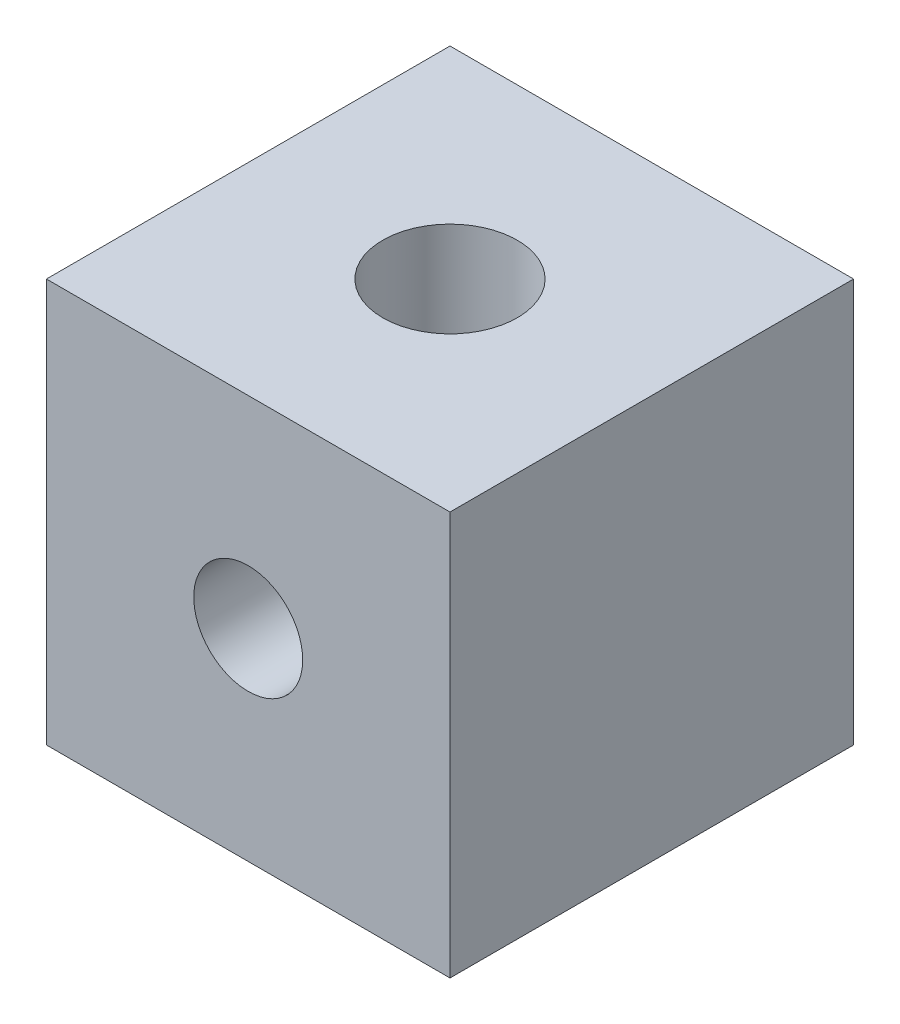
ISO-10303-21;
HEADER;
FILE_DESCRIPTION(('STEP AP214'),'2;1');
FILE_NAME('part.step','',(''),(''),'','','');
FILE_SCHEMA(('AUTOMOTIVE_DESIGN { 1 0 10303 214 1 1 1 1 }'));
ENDSEC;
DATA;
#1=APPLICATION_CONTEXT('core data for automotive mechanical design processes');
#2=APPLICATION_PROTOCOL_DEFINITION('international standard','automotive_design',2000,#1);
#3=PRODUCT_CONTEXT('',#1,'mechanical');
#4=PRODUCT('Part','Part','',(#3));
#5=PRODUCT_RELATED_PRODUCT_CATEGORY('part','',(#4));
#6=PRODUCT_DEFINITION_FORMATION('','',#4);
#7=PRODUCT_DEFINITION_CONTEXT('part definition',#1,'design');
#8=PRODUCT_DEFINITION('design','',#6,#7);
#9=PRODUCT_DEFINITION_SHAPE('','',#8);
#10=(LENGTH_UNIT() NAMED_UNIT(*) SI_UNIT(.MILLI.,.METRE.));
#11=(NAMED_UNIT(*) PLANE_ANGLE_UNIT() SI_UNIT($,.RADIAN.));
#12=(NAMED_UNIT(*) SI_UNIT($,.STERADIAN.) SOLID_ANGLE_UNIT());
#13=UNCERTAINTY_MEASURE_WITH_UNIT(LENGTH_MEASURE(1.E-05),#10,'distance_accuracy_value','');
#14=(GEOMETRIC_REPRESENTATION_CONTEXT(3) GLOBAL_UNCERTAINTY_ASSIGNED_CONTEXT((#13)) GLOBAL_UNIT_ASSIGNED_CONTEXT((#10,
#11,#12)) REPRESENTATION_CONTEXT('',''));
#15=CARTESIAN_POINT('',(0.,0.,0.));
#16=DIRECTION('',(0.,0.,1.));
#17=DIRECTION('',(1.,0.,0.));
#18=AXIS2_PLACEMENT_3D('',#15,#16,#17);
#19=CARTESIAN_POINT('',(0.,0.,0.));
#20=DIRECTION('',(0.,0.,1.));
#21=DIRECTION('',(1.,0.,0.));
#22=AXIS2_PLACEMENT_3D('',#19,#20,#21);
#23=CYLINDRICAL_SURFACE('',#22,5.1435);
#24=CARTESIAN_POINT('',(0.,0.,38.1));
#25=DIRECTION('',(0.,0.,1.));
#26=DIRECTION('',(1.,0.,0.));
#27=AXIS2_PLACEMENT_3D('',#24,#25,#26);
#28=CIRCLE('',#27,5.1435);
#29=CARTESIAN_POINT('',(5.1435,0.,38.1));
#30=VERTEX_POINT('',#29);
#31=EDGE_CURVE('E105',#30,#30,#28,.T.);
#32=ORIENTED_EDGE('',*,*,#31,.T.);
#33=EDGE_LOOP('',(#32));
#34=FACE_BOUND('',#33,.T.);
#35=CARTESIAN_POINT('',(0.,0.,0.));
#36=DIRECTION('',(0.,0.,1.));
#37=DIRECTION('',(1.,0.,0.));
#38=AXIS2_PLACEMENT_3D('',#35,#36,#37);
#39=CIRCLE('',#38,5.1435);
#40=CARTESIAN_POINT('',(5.1435,0.,0.));
#41=VERTEX_POINT('',#40);
#42=EDGE_CURVE('E146',#41,#41,#39,.T.);
#43=ORIENTED_EDGE('',*,*,#42,.F.);
#44=EDGE_LOOP('',(#43));
#45=FACE_BOUND('',#44,.T.);
#46=DIRECTION('',(0.,0.,1.));
#47=VECTOR('',#46,1.);
#48=CARTESIAN_POINT('',(-5.1435,0.,0.));
#49=LINE('',#48,#47);
#50=CARTESIAN_POINT('',(-5.1435,0.,22.7738297154945));
#51=VERTEX_POINT('',#50);
#52=CARTESIAN_POINT('',(-5.1435,0.,15.3261702845055));
#53=VERTEX_POINT('',#52);
#54=EDGE_CURVE('E11',#51,#53,#49,.F.);
#55=ORIENTED_EDGE('',*,*,#54,.F.);
#56=CARTESIAN_POINT('',(-5.1435,0.,22.7738297154945));
#57=CARTESIAN_POINT('',(-5.14352241609318,0.0959412913082309,22.7737663258344));
#58=CARTESIAN_POINT('',(-5.14081669099411,0.191843923656308,22.7775358145232));
#59=CARTESIAN_POINT('',(-5.13012972437441,0.382637566188221,22.7922472820751));
#60=CARTESIAN_POINT('',(-5.12215776863052,0.477530058800628,22.8031766358946));
#61=CARTESIAN_POINT('',(-5.10126200983719,0.664423592876444,22.831522340203));
#62=CARTESIAN_POINT('',(-5.08840750492922,0.75644643467787,22.8488478179409));
#63=CARTESIAN_POINT('',(-5.05800351351112,0.938461364779289,22.8892372495825));
#64=CARTESIAN_POINT('',(-5.04045162761462,1.02845238969794,22.9123041357315));
#65=CARTESIAN_POINT('',(-4.99365398875375,1.23875219280959,22.9727368167358));
#66=CARTESIAN_POINT('',(-4.96248224131294,1.35801921204071,23.0122399222095));
#67=CARTESIAN_POINT('',(-4.8925505092756,1.59167543270372,23.0982737625678));
#68=CARTESIAN_POINT('',(-4.85378776158299,1.70606283945556,23.1448070550007));
#69=CARTESIAN_POINT('',(-4.76891620880948,1.93068543419565,23.2433512738867));
#70=CARTESIAN_POINT('',(-4.72275746176786,2.04088559681749,23.2953985607568));
#71=CARTESIAN_POINT('',(-4.62367623594436,2.25638634443206,23.4030999792471));
#72=CARTESIAN_POINT('',(-4.57075171581879,2.36168543755871,23.4587551969304));
#73=CARTESIAN_POINT('',(-4.43695335269834,2.60677786833189,23.5940192210679));
#74=CARTESIAN_POINT('',(-4.35312246509043,2.74439471985994,23.674661866338));
#75=CARTESIAN_POINT('',(-4.17342782743831,3.01062996448624,23.8374548003026));
#76=CARTESIAN_POINT('',(-4.07755960676395,3.13924498654762,23.9196056394071));
#77=CARTESIAN_POINT('',(-3.87415229289318,3.3870592517756,24.0829333255002));
#78=CARTESIAN_POINT('',(-3.76663636369137,3.50627639718188,24.1641117616325));
#79=CARTESIAN_POINT('',(-3.53993186850916,3.73502387737163,24.3235761743329));
#80=CARTESIAN_POINT('',(-3.42074735791211,3.84455755260957,24.4018631428861));
#81=CARTESIAN_POINT('',(-3.0961053933959,4.11549327872121,24.598970586322));
#82=CARTESIAN_POINT('',(-2.88155825993565,4.26891099482268,24.7141471069758));
#83=CARTESIAN_POINT('',(-2.42434013235631,4.54413681137405,24.924372836621));
#84=CARTESIAN_POINT('',(-2.18170868821159,4.66598859976346,25.019449829892));
#85=CARTESIAN_POINT('',(-1.71405214274505,4.85491084491618,25.1683557689797));
#86=CARTESIAN_POINT('',(-1.49273200379794,4.92770382446126,25.226402861211));
#87=CARTESIAN_POINT('',(-1.15159758393714,5.01430406661325,25.2957880321566));
#88=CARTESIAN_POINT('',(-1.03632742861999,5.03940973980861,25.3159719626812));
#89=CARTESIAN_POINT('',(-0.803452008478206,5.08173548405308,25.350062083331));
#90=CARTESIAN_POINT('',(-0.685847699789827,5.09895871715024,25.363970790736));
#91=CARTESIAN_POINT('',(-0.448675053063616,5.12528831552085,25.3852528372238));
#92=CARTESIAN_POINT('',(-0.329100798559673,5.1343624024632,25.3926001864796));
#93=CARTESIAN_POINT('',(-0.0893829684900481,5.14412193797864,25.400503111639));
#94=CARTESIAN_POINT('',(0.0307606082086079,5.14480736985094,25.4010586740211));
#95=CARTESIAN_POINT('',(0.270639388740155,5.13777630558884,25.395364367246));
#96=CARTESIAN_POINT('',(0.390374587339165,5.13005970217462,25.3891144111937));
#97=CARTESIAN_POINT('',(0.628478191530543,5.10636096204844,25.3699510762319));
#98=CARTESIAN_POINT('',(0.746846632857706,5.09037904194133,25.3570378719427));
#99=CARTESIAN_POINT('',(0.974476139759268,5.05158651905677,25.3257716700088));
#100=CARTESIAN_POINT('',(1.08386494305433,5.02923001010819,25.3077810299759));
#101=CARTESIAN_POINT('',(1.3000246117107,4.97773954125728,25.2664752846806));
#102=CARTESIAN_POINT('',(1.40679457559769,4.94860328279573,25.2431583736854));
#103=CARTESIAN_POINT('',(1.72226102696323,4.85156943774839,25.1658064656043));
#104=CARTESIAN_POINT('',(1.92627014158617,4.77401951981077,25.1043480545387));
#105=CARTESIAN_POINT('',(2.33653906470988,4.58820507293192,24.9588810994617));
#106=CARTESIAN_POINT('',(2.54122702747224,4.47774723667298,24.8733017765978));
#107=CARTESIAN_POINT('',(2.9294162408308,4.23399376518165,24.6880272168192));
#108=CARTESIAN_POINT('',(3.1129068867094,4.10068678096209,24.5883249694541));
#109=CARTESIAN_POINT('',(3.49364756716477,3.78461466486705,24.3581095737289));
#110=CARTESIAN_POINT('',(3.68588645513111,3.59732348662403,24.2254901973739));
#111=CARTESIAN_POINT('',(3.94983640868036,3.29729613303456,24.0232951281892));
#112=CARTESIAN_POINT('',(4.03382782101536,3.19398539399036,23.9552784867769));
#113=CARTESIAN_POINT('',(4.19359757433396,2.98111301557759,23.8194034916728));
#114=CARTESIAN_POINT('',(4.26937869626093,2.8715535120694,23.7515450920505));
#115=CARTESIAN_POINT('',(4.40781062519785,2.65373687907296,23.6218807947994));
#116=CARTESIAN_POINT('',(4.47100047117304,2.54588202025887,23.559973478323));
#117=CARTESIAN_POINT('',(4.58993022194236,2.32463170799464,23.4388767271116));
#118=CARTESIAN_POINT('',(4.64566896632704,2.21123539528355,23.3796877166565));
#119=CARTESIAN_POINT('',(4.74927008167985,1.97893039527966,23.2657859564855));
#120=CARTESIAN_POINT('',(4.79714382876616,1.8600299943041,23.2110668001481));
#121=CARTESIAN_POINT('',(4.88456327312677,1.61659431242875,23.108090553243));
#122=CARTESIAN_POINT('',(4.92411345623739,1.49206211088044,23.0598299870662));
#123=CARTESIAN_POINT('',(5.00727219076622,1.189785178499,22.955852585455));
#124=CARTESIAN_POINT('',(5.04691623409729,1.0094803746078,22.9040417513256));
#125=CARTESIAN_POINT('',(5.09183115410873,0.733182191829155,22.8442547113774));
#126=CARTESIAN_POINT('',(5.1043709249231,0.64023007447147,22.8273239931385));
#127=CARTESIAN_POINT('',(5.1243913514995,0.452835030400315,22.8001206132091));
#128=CARTESIAN_POINT('',(5.13187547827857,0.358393172168225,22.7898433836831));
#129=CARTESIAN_POINT('',(5.1389904319845,0.219772891767148,22.7800521752633));
#130=CARTESIAN_POINT('',(5.14068014718355,0.175875771312997,22.7777221781561));
#131=CARTESIAN_POINT('',(5.14293521064505,0.0879881559268873,22.774610018656));
#132=CARTESIAN_POINT('',(5.14350030798503,0.0439976423485187,22.7738282016902));
#133=CARTESIAN_POINT('',(5.1435,0.,22.7738297154945));
#134=B_SPLINE_CURVE_WITH_KNOTS('',3,(#56,#57,#58,#59,#60,#61,#62,#63,#64,#65,#66,#67,#68,#69,
#70,#71,#72,#73,#74,#75,#76,#77,#78,#79,#80,#81,#82,#83,#84,#85,#86,#87,#88,#89,#90,#91,#92,#93,
#94,#95,#96,#97,#98,#99,#100,#101,#102,#103,#104,#105,#106,#107,#108,#109,#110,#111,#112,#113,
#114,#115,#116,#117,#118,#119,#120,#121,#122,#123,#124,#125,#126,#127,#128,#129,#130,#131,#132,
#133),.UNSPECIFIED.,.F.,.F.,(4,2,2,2,2,2,2,2,2,2,2,2,2,2,2,2,2,2,2,2,2,2,2,2,2,2,2,2,2,2,2,2,2,
2,2,2,2,2,4),(0.,0.287649953282519,0.574794051582179,0.858006409674555,1.14136370749616,
1.52908909811353,1.9169558825473,2.30756162664261,2.69828550222207,3.23816059551168,
3.7782367932176,4.31725799258367,4.8560925171837,5.71600237862985,6.57471566949755,
7.29168123517888,7.65036147067549,8.00889769487705,8.36884787710352,8.72879877594631,
9.08875427080861,9.44870033298235,9.78759278786573,10.1266003063321,10.8041406780934,
11.5450081753957,12.2862447276305,13.1808808901427,13.6291518004339,14.0772703970794,
14.4954416203012,14.9136778924174,15.3313037875967,15.7487040311029,16.3213954046949,
16.6070222605932,16.8924528158707,17.0243917872,17.1563601931884),.UNSPECIFIED.);
#135=CARTESIAN_POINT('',(5.1435,0.,22.7738297154945));
#136=VERTEX_POINT('',#135);
#137=EDGE_CURVE('E41',#51,#136,#134,.T.);
#138=ORIENTED_EDGE('',*,*,#137,.T.);
#139=DIRECTION('',(0.,0.,1.));
#140=VECTOR('',#139,1.);
#141=CARTESIAN_POINT('',(5.1435,0.,0.));
#142=LINE('',#141,#140);
#143=CARTESIAN_POINT('',(5.1435,0.,15.3261702845055));
#144=VERTEX_POINT('',#143);
#145=EDGE_CURVE('E93',#144,#136,#142,.T.);
#146=ORIENTED_EDGE('',*,*,#145,.F.);
#147=CARTESIAN_POINT('',(5.1435,0.,15.3261702845055));
#148=CARTESIAN_POINT('',(5.14352241609318,0.095941291308231,15.3262336741657));
#149=CARTESIAN_POINT('',(5.14081669099411,0.191843923656308,15.3224641854768));
#150=CARTESIAN_POINT('',(5.13012972437441,0.382637566188222,15.3077527179249));
#151=CARTESIAN_POINT('',(5.12215776863052,0.477530058800629,15.2968233641054));
#152=CARTESIAN_POINT('',(5.10126200983719,0.664423592876445,15.268477659797));
#153=CARTESIAN_POINT('',(5.08840750492922,0.756446434677871,15.2511521820592));
#154=CARTESIAN_POINT('',(5.05800351351112,0.93846136477929,15.2107627504175));
#155=CARTESIAN_POINT('',(5.04045162761462,1.02845238969794,15.1876958642685));
#156=CARTESIAN_POINT('',(4.99365398875375,1.23875219280959,15.1272631832643));
#157=CARTESIAN_POINT('',(4.96248224131294,1.35801921204072,15.0877600777905));
#158=CARTESIAN_POINT('',(4.8925505092756,1.59167543270372,15.0017262374323));
#159=CARTESIAN_POINT('',(4.85378776158299,1.70606283945556,14.9551929449993));
#160=CARTESIAN_POINT('',(4.76891620880947,1.93068543419565,14.8566487261133));
#161=CARTESIAN_POINT('',(4.72275746176786,2.0408855968175,14.8046014392432));
#162=CARTESIAN_POINT('',(4.62367623594436,2.25638634443207,14.6969000207529));
#163=CARTESIAN_POINT('',(4.57075171581879,2.36168543755871,14.6412448030696));
#164=CARTESIAN_POINT('',(4.43695335269834,2.60677786833189,14.5059807789321));
#165=CARTESIAN_POINT('',(4.35312246509043,2.74439471985994,14.425338133662));
#166=CARTESIAN_POINT('',(4.17342782743831,3.01062996448624,14.2625451996974));
#167=CARTESIAN_POINT('',(4.07755960676395,3.13924498654762,14.1803943605929));
#168=CARTESIAN_POINT('',(3.87415229289318,3.3870592517756,14.0170666744998));
#169=CARTESIAN_POINT('',(3.76663636369137,3.50627639718188,13.9358882383675));
#170=CARTESIAN_POINT('',(3.53993186850916,3.73502387737163,13.7764238256672));
#171=CARTESIAN_POINT('',(3.42074735791211,3.84455755260957,13.6981368571139));
#172=CARTESIAN_POINT('',(3.0961053933959,4.11549327872121,13.501029413678));
#173=CARTESIAN_POINT('',(2.88155825993564,4.26891099482268,13.3858528930243));
#174=CARTESIAN_POINT('',(2.4243401323563,4.54413681137405,13.175627163379));
#175=CARTESIAN_POINT('',(2.18170868821159,4.66598859976346,13.0805501701081));
#176=CARTESIAN_POINT('',(1.71405214274505,4.85491084491618,12.9316442310203));
#177=CARTESIAN_POINT('',(1.49273200379794,4.92770382446126,12.8735971387891));
#178=CARTESIAN_POINT('',(1.15159758393714,5.01430406661325,12.8042119678435));
#179=CARTESIAN_POINT('',(1.03632742861999,5.03940973980861,12.7840280373188));
#180=CARTESIAN_POINT('',(0.803452008478206,5.08173548405308,12.749937916669));
#181=CARTESIAN_POINT('',(0.685847699789827,5.09895871715024,12.736029209264));
#182=CARTESIAN_POINT('',(0.448675053063616,5.12528831552085,12.7147471627762));
#183=CARTESIAN_POINT('',(0.329100798559673,5.1343624024632,12.7073998135205));
#184=CARTESIAN_POINT('',(0.0893829684900479,5.14412193797864,12.699496888361));
#185=CARTESIAN_POINT('',(-0.0307606082086081,5.14480736985094,12.6989413259789));
#186=CARTESIAN_POINT('',(-0.270639388740155,5.13777630558884,12.7046356327541));
#187=CARTESIAN_POINT('',(-0.390374587339164,5.13005970217462,12.7108855888063));
#188=CARTESIAN_POINT('',(-0.628478191530542,5.10636096204844,12.7300489237681));
#189=CARTESIAN_POINT('',(-0.746846632857706,5.09037904194133,12.7429621280574));
#190=CARTESIAN_POINT('',(-0.974476139759268,5.05158651905677,12.7742283299912));
#191=CARTESIAN_POINT('',(-1.08386494305433,5.02923001010819,12.7922189700241));
#192=CARTESIAN_POINT('',(-1.3000246117107,4.97773954125728,12.8335247153194));
#193=CARTESIAN_POINT('',(-1.40679457559769,4.94860328279573,12.8568416263146));
#194=CARTESIAN_POINT('',(-1.72226102696323,4.85156943774839,12.9341935343958));
#195=CARTESIAN_POINT('',(-1.92627014158617,4.77401951981077,12.9956519454613));
#196=CARTESIAN_POINT('',(-2.33653906470988,4.58820507293192,13.1411189005383));
#197=CARTESIAN_POINT('',(-2.54122702747224,4.47774723667298,13.2266982234022));
#198=CARTESIAN_POINT('',(-2.9294162408308,4.23399376518165,13.4119727831808));
#199=CARTESIAN_POINT('',(-3.1129068867094,4.10068678096209,13.5116750305459));
#200=CARTESIAN_POINT('',(-3.49364756716476,3.78461466486706,13.7418904262711));
#201=CARTESIAN_POINT('',(-3.68588645513111,3.59732348662403,13.8745098026262));
#202=CARTESIAN_POINT('',(-3.94983640868036,3.29729613303457,14.0767048718108));
#203=CARTESIAN_POINT('',(-4.03382782101535,3.19398539399037,14.1447215132231));
#204=CARTESIAN_POINT('',(-4.19359757433395,2.98111301557759,14.2805965083272));
#205=CARTESIAN_POINT('',(-4.26937869626093,2.8715535120694,14.3484549079495));
#206=CARTESIAN_POINT('',(-4.40781062519785,2.65373687907296,14.4781192052006));
#207=CARTESIAN_POINT('',(-4.47100047117304,2.54588202025888,14.540026521677));
#208=CARTESIAN_POINT('',(-4.58993022194236,2.32463170799465,14.6611232728884));
#209=CARTESIAN_POINT('',(-4.64566896632704,2.21123539528355,14.7203122833435));
#210=CARTESIAN_POINT('',(-4.74927008167985,1.97893039527966,14.8342140435145));
#211=CARTESIAN_POINT('',(-4.79714382876616,1.8600299943041,14.8889331998519));
#212=CARTESIAN_POINT('',(-4.88456327312677,1.61659431242876,14.991909446757));
#213=CARTESIAN_POINT('',(-4.92411345623739,1.49206211088044,15.0401700129339));
#214=CARTESIAN_POINT('',(-5.00727219076622,1.189785178499,15.144147414545));
#215=CARTESIAN_POINT('',(-5.04691623409729,1.0094803746078,15.1959582486744));
#216=CARTESIAN_POINT('',(-5.09183115410873,0.733182191829156,15.2557452886226));
#217=CARTESIAN_POINT('',(-5.1043709249231,0.64023007447147,15.2726760068615));
#218=CARTESIAN_POINT('',(-5.1243913514995,0.452835030400315,15.2998793867909));
#219=CARTESIAN_POINT('',(-5.13187547827857,0.358393172168223,15.3101566163169));
#220=CARTESIAN_POINT('',(-5.1389904319845,0.219772891767146,15.3199478247367));
#221=CARTESIAN_POINT('',(-5.14068014718355,0.175875771312996,15.3222778218439));
#222=CARTESIAN_POINT('',(-5.14293521064505,0.0879881559268871,15.325389981344));
#223=CARTESIAN_POINT('',(-5.14350030798503,0.0439976423485185,15.3261717983098));
#224=CARTESIAN_POINT('',(-5.1435,0.,15.3261702845055));
#225=B_SPLINE_CURVE_WITH_KNOTS('',3,(#147,#148,#149,#150,#151,#152,#153,#154,#155,#156,#157,
#158,#159,#160,#161,#162,#163,#164,#165,#166,#167,#168,#169,#170,#171,#172,#173,#174,#175,#176,
#177,#178,#179,#180,#181,#182,#183,#184,#185,#186,#187,#188,#189,#190,#191,#192,#193,#194,#195,
#196,#197,#198,#199,#200,#201,#202,#203,#204,#205,#206,#207,#208,#209,#210,#211,#212,#213,#214,
#215,#216,#217,#218,#219,#220,#221,#222,#223,#224),.UNSPECIFIED.,.F.,.F.,(4,2,2,2,2,2,2,2,2,2,2,
2,2,2,2,2,2,2,2,2,2,2,2,2,2,2,2,2,2,2,2,2,2,2,2,2,2,2,4),(0.,0.28764995328252,0.57479405158218,
0.858006409674555,1.14136370749617,1.52908909811353,1.91695588254731,2.30756162664262,
2.69828550222207,3.23816059551168,3.7782367932176,4.31725799258367,4.8560925171837,
5.71600237862985,6.57471566949755,7.29168123517888,7.65036147067549,8.00889769487705,
8.36884787710352,8.72879877594631,9.08875427080861,9.44870033298235,9.78759278786573,
10.1266003063321,10.8041406780934,11.5450081753957,12.2862447276305,13.1808808901427,
13.6291518004338,14.0772703970794,14.4954416203012,14.9136778924174,15.3313037875967,
15.7487040311029,16.3213954046949,16.6070222605932,16.8924528158707,17.0243917872,
17.1563601931884),.UNSPECIFIED.);
#226=EDGE_CURVE('E98',#144,#53,#225,.T.);
#227=ORIENTED_EDGE('',*,*,#226,.T.);
#228=EDGE_LOOP('',(#55,#138,#146,#227));
#229=FACE_BOUND('',#228,.T.);
#230=ADVANCED_FACE('F33',(#34,#45,#229),#23,.F.);
#231=CARTESIAN_POINT('',(19.05,19.05,38.1));
#232=DIRECTION('',(-1.,0.,0.));
#233=DIRECTION('',(0.,-1.,0.));
#234=AXIS2_PLACEMENT_3D('',#231,#232,#233);
#235=PLANE('',#234);
#236=DIRECTION('',(0.,1.,0.));
#237=VECTOR('',#236,1.);
#238=CARTESIAN_POINT('',(19.05,19.05,0.));
#239=LINE('',#238,#237);
#240=CARTESIAN_POINT('',(19.05,-19.05,0.));
#241=VERTEX_POINT('',#240);
#242=CARTESIAN_POINT('',(19.05,19.05,0.));
#243=VERTEX_POINT('',#242);
#244=EDGE_CURVE('E148',#241,#243,#239,.T.);
#245=ORIENTED_EDGE('',*,*,#244,.T.);
#246=DIRECTION('',(0.,0.,-1.));
#247=VECTOR('',#246,1.);
#248=CARTESIAN_POINT('',(19.05,19.05,38.1));
#249=LINE('',#248,#247);
#250=CARTESIAN_POINT('',(19.05,19.05,38.1));
#251=VERTEX_POINT('',#250);
#252=EDGE_CURVE('E99',#251,#243,#249,.T.);
#253=ORIENTED_EDGE('',*,*,#252,.F.);
#254=DIRECTION('',(0.,1.,0.));
#255=VECTOR('',#254,1.);
#256=CARTESIAN_POINT('',(19.05,19.05,38.1));
#257=LINE('',#256,#255);
#258=CARTESIAN_POINT('',(19.05,-19.05,38.1));
#259=VERTEX_POINT('',#258);
#260=EDGE_CURVE('E157',#259,#251,#257,.T.);
#261=ORIENTED_EDGE('',*,*,#260,.F.);
#262=DIRECTION('',(0.,0.,-1.));
#263=VECTOR('',#262,1.);
#264=CARTESIAN_POINT('',(19.05,-19.05,38.1));
#265=LINE('',#264,#263);
#266=EDGE_CURVE('E162',#259,#241,#265,.T.);
#267=ORIENTED_EDGE('',*,*,#266,.T.);
#268=EDGE_LOOP('',(#245,#253,#261,#267));
#269=FACE_BOUND('',#268,.T.);
#270=ADVANCED_FACE('F35',(#269),#235,.F.);
#271=CARTESIAN_POINT('',(-19.05,19.05,38.1));
#272=DIRECTION('',(0.,-1.,0.));
#273=DIRECTION('',(0.,0.,-1.));
#274=AXIS2_PLACEMENT_3D('',#271,#272,#273);
#275=PLANE('',#274);
#276=CARTESIAN_POINT('',(0.,19.05,19.05));
#277=DIRECTION('',(0.,1.,0.));
#278=DIRECTION('',(0.,0.,1.));
#279=AXIS2_PLACEMENT_3D('',#276,#277,#278);
#280=CIRCLE('',#279,6.35);
#281=CARTESIAN_POINT('',(0.,19.05,25.4));
#282=VERTEX_POINT('',#281);
#283=EDGE_CURVE('E155',#282,#282,#280,.T.);
#284=ORIENTED_EDGE('',*,*,#283,.F.);
#285=EDGE_LOOP('',(#284));
#286=FACE_BOUND('',#285,.T.);
#287=DIRECTION('',(-1.,0.,0.));
#288=VECTOR('',#287,1.);
#289=CARTESIAN_POINT('',(-19.05,19.05,0.));
#290=LINE('',#289,#288);
#291=CARTESIAN_POINT('',(-19.05,19.05,0.));
#292=VERTEX_POINT('',#291);
#293=EDGE_CURVE('E151',#243,#292,#290,.T.);
#294=ORIENTED_EDGE('',*,*,#293,.T.);
#295=DIRECTION('',(0.,0.,-1.));
#296=VECTOR('',#295,1.);
#297=CARTESIAN_POINT('',(-19.05,19.05,38.1));
#298=LINE('',#297,#296);
#299=CARTESIAN_POINT('',(-19.05,19.05,38.1));
#300=VERTEX_POINT('',#299);
#301=EDGE_CURVE('E171',#300,#292,#298,.T.);
#302=ORIENTED_EDGE('',*,*,#301,.F.);
#303=DIRECTION('',(-1.,0.,0.));
#304=VECTOR('',#303,1.);
#305=CARTESIAN_POINT('',(-19.05,19.05,38.1));
#306=LINE('',#305,#304);
#307=EDGE_CURVE('E85',#251,#300,#306,.T.);
#308=ORIENTED_EDGE('',*,*,#307,.F.);
#309=ORIENTED_EDGE('',*,*,#252,.T.);
#310=EDGE_LOOP('',(#294,#302,#308,#309));
#311=FACE_BOUND('',#310,.T.);
#312=ADVANCED_FACE('F139',(#286,#311),#275,.F.);
#313=CARTESIAN_POINT('',(-19.05,19.05,38.1));
#314=DIRECTION('',(1.,0.,0.));
#315=DIRECTION('',(0.,1.,0.));
#316=AXIS2_PLACEMENT_3D('',#313,#314,#315);
#317=PLANE('',#316);
#318=DIRECTION('',(0.,-1.,0.));
#319=VECTOR('',#318,1.);
#320=CARTESIAN_POINT('',(-19.05,19.05,0.));
#321=LINE('',#320,#319);
#322=CARTESIAN_POINT('',(-19.05,-19.05,0.));
#323=VERTEX_POINT('',#322);
#324=EDGE_CURVE('E165',#292,#323,#321,.T.);
#325=ORIENTED_EDGE('',*,*,#324,.T.);
#326=DIRECTION('',(0.,0.,-1.));
#327=VECTOR('',#326,1.);
#328=CARTESIAN_POINT('',(-19.05,-19.05,38.1));
#329=LINE('',#328,#327);
#330=CARTESIAN_POINT('',(-19.05,-19.05,38.1));
#331=VERTEX_POINT('',#330);
#332=EDGE_CURVE('E169',#331,#323,#329,.T.);
#333=ORIENTED_EDGE('',*,*,#332,.F.);
#334=DIRECTION('',(0.,-1.,0.));
#335=VECTOR('',#334,1.);
#336=CARTESIAN_POINT('',(-19.05,19.05,38.1));
#337=LINE('',#336,#335);
#338=EDGE_CURVE('E160',#300,#331,#337,.T.);
#339=ORIENTED_EDGE('',*,*,#338,.F.);
#340=ORIENTED_EDGE('',*,*,#301,.T.);
#341=EDGE_LOOP('',(#325,#333,#339,#340));
#342=FACE_BOUND('',#341,.T.);
#343=ADVANCED_FACE('F181',(#342),#317,.F.);
#344=CARTESIAN_POINT('',(-19.05,-19.05,38.1));
#345=DIRECTION('',(0.,1.,0.));
#346=DIRECTION('',(0.,0.,1.));
#347=AXIS2_PLACEMENT_3D('',#344,#345,#346);
#348=PLANE('',#347);
#349=DIRECTION('',(1.,0.,0.));
#350=VECTOR('',#349,1.);
#351=CARTESIAN_POINT('',(-19.05,-19.05,0.));
#352=LINE('',#351,#350);
#353=EDGE_CURVE('E77',#323,#241,#352,.T.);
#354=ORIENTED_EDGE('',*,*,#353,.T.);
#355=ORIENTED_EDGE('',*,*,#266,.F.);
#356=DIRECTION('',(1.,0.,0.));
#357=VECTOR('',#356,1.);
#358=CARTESIAN_POINT('',(-19.05,-19.05,38.1));
#359=LINE('',#358,#357);
#360=EDGE_CURVE('E56',#331,#259,#359,.T.);
#361=ORIENTED_EDGE('',*,*,#360,.F.);
#362=ORIENTED_EDGE('',*,*,#332,.T.);
#363=EDGE_LOOP('',(#354,#355,#361,#362));
#364=FACE_BOUND('',#363,.T.);
#365=ADVANCED_FACE('F183',(#364),#348,.F.);
#366=CARTESIAN_POINT('',(0.,0.,38.1));
#367=DIRECTION('',(0.,0.,1.));
#368=DIRECTION('',(1.,0.,0.));
#369=AXIS2_PLACEMENT_3D('',#366,#367,#368);
#370=PLANE('',#369);
#371=ORIENTED_EDGE('',*,*,#31,.F.);
#372=EDGE_LOOP('',(#371));
#373=FACE_BOUND('',#372,.T.);
#374=ORIENTED_EDGE('',*,*,#260,.T.);
#375=ORIENTED_EDGE('',*,*,#307,.T.);
#376=ORIENTED_EDGE('',*,*,#338,.T.);
#377=ORIENTED_EDGE('',*,*,#360,.T.);
#378=EDGE_LOOP('',(#374,#375,#376,#377));
#379=FACE_BOUND('',#378,.T.);
#380=ADVANCED_FACE('F184',(#373,#379),#370,.T.);
#381=CARTESIAN_POINT('',(0.,0.,0.));
#382=DIRECTION('',(0.,0.,1.));
#383=DIRECTION('',(1.,0.,0.));
#384=AXIS2_PLACEMENT_3D('',#381,#382,#383);
#385=PLANE('',#384);
#386=ORIENTED_EDGE('',*,*,#42,.T.);
#387=EDGE_LOOP('',(#386));
#388=FACE_BOUND('',#387,.T.);
#389=ORIENTED_EDGE('',*,*,#244,.F.);
#390=ORIENTED_EDGE('',*,*,#353,.F.);
#391=ORIENTED_EDGE('',*,*,#324,.F.);
#392=ORIENTED_EDGE('',*,*,#293,.F.);
#393=EDGE_LOOP('',(#389,#390,#391,#392));
#394=FACE_BOUND('',#393,.T.);
#395=ADVANCED_FACE('F126',(#388,#394),#385,.F.);
#396=CARTESIAN_POINT('',(0.,0.,19.05));
#397=DIRECTION('',(0.,1.,0.));
#398=DIRECTION('',(0.,0.,1.));
#399=AXIS2_PLACEMENT_3D('',#396,#397,#398);
#400=CYLINDRICAL_SURFACE('',#399,6.35);
#401=ORIENTED_EDGE('',*,*,#283,.T.);
#402=EDGE_LOOP('',(#401));
#403=FACE_BOUND('',#402,.T.);
#404=CARTESIAN_POINT('',(0.,0.,19.05));
#405=DIRECTION('',(0.,1.,0.));
#406=DIRECTION('',(0.,0.,1.));
#407=AXIS2_PLACEMENT_3D('',#404,#405,#406);
#408=CIRCLE('',#407,6.35);
#409=EDGE_CURVE('E106',#53,#51,#408,.T.);
#410=ORIENTED_EDGE('',*,*,#409,.F.);
#411=ORIENTED_EDGE('',*,*,#226,.F.);
#412=EDGE_CURVE('E47',#136,#144,#408,.T.);
#413=ORIENTED_EDGE('',*,*,#412,.F.);
#414=ORIENTED_EDGE('',*,*,#137,.F.);
#415=EDGE_LOOP('',(#410,#411,#413,#414));
#416=FACE_BOUND('',#415,.T.);
#417=ADVANCED_FACE('F103',(#403,#416),#400,.F.);
#418=CARTESIAN_POINT('',(0.,0.,19.05));
#419=DIRECTION('',(0.,1.,0.));
#420=DIRECTION('',(0.,0.,1.));
#421=AXIS2_PLACEMENT_3D('',#418,#419,#420);
#422=PLANE('',#421);
#423=ORIENTED_EDGE('',*,*,#54,.T.);
#424=ORIENTED_EDGE('',*,*,#409,.T.);
#425=EDGE_LOOP('',(#423,#424));
#426=FACE_BOUND('',#425,.T.);
#427=ADVANCED_FACE('F125',(#426),#422,.T.);
#428=ORIENTED_EDGE('',*,*,#145,.T.);
#429=ORIENTED_EDGE('',*,*,#412,.T.);
#430=EDGE_LOOP('',(#428,#429));
#431=FACE_BOUND('',#430,.T.);
#432=ADVANCED_FACE('F94',(#431),#422,.T.);
#433=CLOSED_SHELL('',(#230,#270,#312,#343,#365,#380,#395,#417,#427,#432));
#434=MANIFOLD_SOLID_BREP('B2',#433);
#435=ADVANCED_BREP_SHAPE_REPRESENTATION('',(#18,#434),#14);
#436=SHAPE_DEFINITION_REPRESENTATION(#9,#435);
ENDSEC;
END-ISO-10303-21;
